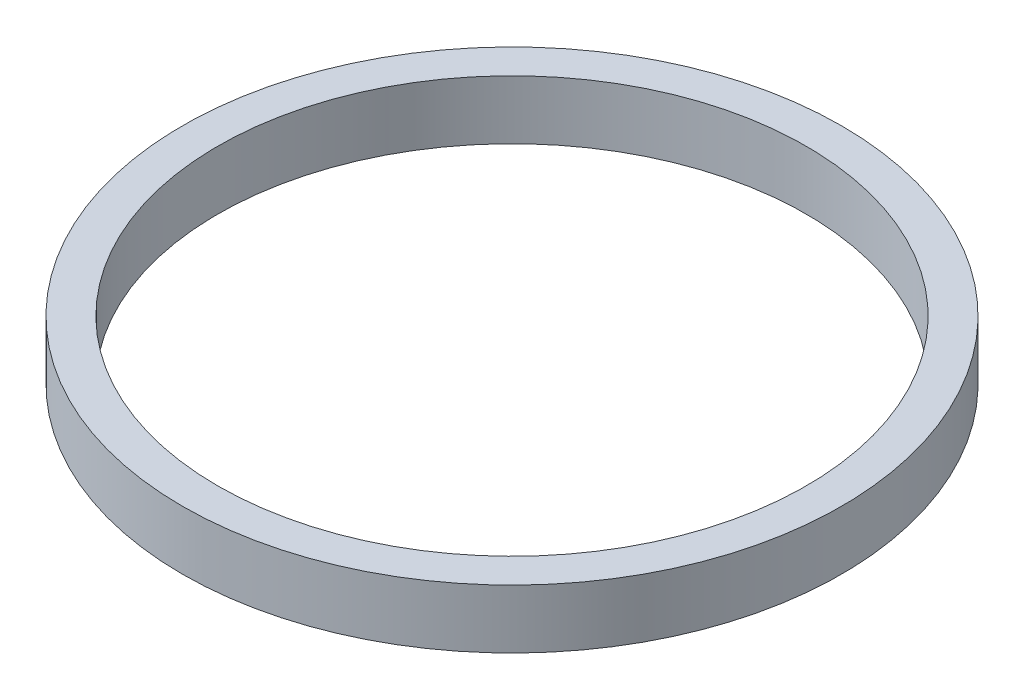
ISO-10303-21;
HEADER;
FILE_DESCRIPTION(('STEP AP214'),'2;1');
FILE_NAME('part.step','',(''),(''),'','','');
FILE_SCHEMA(('AUTOMOTIVE_DESIGN { 1 0 10303 214 1 1 1 1 }'));
ENDSEC;
DATA;
#1=APPLICATION_CONTEXT('core data for automotive mechanical design processes');
#2=APPLICATION_PROTOCOL_DEFINITION('international standard','automotive_design',2000,#1);
#3=PRODUCT_CONTEXT('',#1,'mechanical');
#4=PRODUCT('Part','Part','',(#3));
#5=PRODUCT_RELATED_PRODUCT_CATEGORY('part','',(#4));
#6=PRODUCT_DEFINITION_FORMATION('','',#4);
#7=PRODUCT_DEFINITION_CONTEXT('part definition',#1,'design');
#8=PRODUCT_DEFINITION('design','',#6,#7);
#9=PRODUCT_DEFINITION_SHAPE('','',#8);
#10=(LENGTH_UNIT() NAMED_UNIT(*) SI_UNIT(.MILLI.,.METRE.));
#11=(NAMED_UNIT(*) PLANE_ANGLE_UNIT() SI_UNIT($,.RADIAN.));
#12=(NAMED_UNIT(*) SI_UNIT($,.STERADIAN.) SOLID_ANGLE_UNIT());
#13=UNCERTAINTY_MEASURE_WITH_UNIT(LENGTH_MEASURE(1.E-05),#10,'distance_accuracy_value','');
#14=(GEOMETRIC_REPRESENTATION_CONTEXT(3) GLOBAL_UNCERTAINTY_ASSIGNED_CONTEXT((#13)) GLOBAL_UNIT_ASSIGNED_CONTEXT((#10,
#11,#12)) REPRESENTATION_CONTEXT('',''));
#15=CARTESIAN_POINT('',(0.,0.,0.));
#16=DIRECTION('',(0.,0.,1.));
#17=DIRECTION('',(1.,0.,0.));
#18=AXIS2_PLACEMENT_3D('',#15,#16,#17);
#19=CARTESIAN_POINT('',(0.,2.5,0.));
#20=DIRECTION('',(0.,1.,0.));
#21=DIRECTION('',(0.,0.,1.));
#22=AXIS2_PLACEMENT_3D('',#19,#20,#21);
#23=PLANE('',#22);
#24=CARTESIAN_POINT('',(0.,2.5,0.));
#25=DIRECTION('',(0.,1.,0.));
#26=DIRECTION('',(0.,0.,1.));
#27=AXIS2_PLACEMENT_3D('',#24,#25,#26);
#28=CIRCLE('',#27,14.);
#29=CARTESIAN_POINT('',(0.,2.5,14.));
#30=VERTEX_POINT('',#29);
#31=EDGE_CURVE('E10',#30,#30,#28,.T.);
#32=ORIENTED_EDGE('',*,*,#31,.T.);
#33=EDGE_LOOP('',(#32));
#34=FACE_BOUND('',#33,.T.);
#35=CARTESIAN_POINT('',(0.,2.5,0.));
#36=DIRECTION('',(0.,1.,0.));
#37=DIRECTION('',(0.,0.,1.));
#38=AXIS2_PLACEMENT_3D('',#35,#36,#37);
#39=CIRCLE('',#38,12.5);
#40=CARTESIAN_POINT('',(0.,2.5,12.5));
#41=VERTEX_POINT('',#40);
#42=EDGE_CURVE('E42',#41,#41,#39,.T.);
#43=ORIENTED_EDGE('',*,*,#42,.F.);
#44=EDGE_LOOP('',(#43));
#45=FACE_BOUND('',#44,.T.);
#46=ADVANCED_FACE('F31',(#34,#45),#23,.T.);
#47=CARTESIAN_POINT('',(0.,0.,0.));
#48=DIRECTION('',(0.,1.,0.));
#49=DIRECTION('',(0.,0.,1.));
#50=AXIS2_PLACEMENT_3D('',#47,#48,#49);
#51=PLANE('',#50);
#52=CARTESIAN_POINT('',(0.,0.,0.));
#53=DIRECTION('',(0.,1.,0.));
#54=DIRECTION('',(0.,0.,1.));
#55=AXIS2_PLACEMENT_3D('',#52,#53,#54);
#56=CIRCLE('',#55,14.);
#57=CARTESIAN_POINT('',(0.,0.,14.));
#58=VERTEX_POINT('',#57);
#59=EDGE_CURVE('E35',#58,#58,#56,.T.);
#60=ORIENTED_EDGE('',*,*,#59,.F.);
#61=EDGE_LOOP('',(#60));
#62=FACE_BOUND('',#61,.T.);
#63=CARTESIAN_POINT('',(0.,0.,0.));
#64=DIRECTION('',(0.,1.,0.));
#65=DIRECTION('',(0.,0.,1.));
#66=AXIS2_PLACEMENT_3D('',#63,#64,#65);
#67=CIRCLE('',#66,12.5);
#68=CARTESIAN_POINT('',(0.,0.,12.5));
#69=VERTEX_POINT('',#68);
#70=EDGE_CURVE('E44',#69,#69,#67,.T.);
#71=ORIENTED_EDGE('',*,*,#70,.T.);
#72=EDGE_LOOP('',(#71));
#73=FACE_BOUND('',#72,.T.);
#74=ADVANCED_FACE('F54',(#62,#73),#51,.F.);
#75=CARTESIAN_POINT('',(0.,2.5,0.));
#76=DIRECTION('',(0.,-1.,0.));
#77=DIRECTION('',(0.,0.,-1.));
#78=AXIS2_PLACEMENT_3D('',#75,#76,#77);
#79=CYLINDRICAL_SURFACE('',#78,14.);
#80=ORIENTED_EDGE('',*,*,#31,.F.);
#81=EDGE_LOOP('',(#80));
#82=FACE_BOUND('',#81,.T.);
#83=ORIENTED_EDGE('',*,*,#59,.T.);
#84=EDGE_LOOP('',(#83));
#85=FACE_BOUND('',#84,.T.);
#86=ADVANCED_FACE('F33',(#82,#85),#79,.T.);
#87=CARTESIAN_POINT('',(0.,2.5,0.));
#88=DIRECTION('',(0.,-1.,0.));
#89=DIRECTION('',(0.,0.,-1.));
#90=AXIS2_PLACEMENT_3D('',#87,#88,#89);
#91=CYLINDRICAL_SURFACE('',#90,12.5);
#92=ORIENTED_EDGE('',*,*,#42,.T.);
#93=EDGE_LOOP('',(#92));
#94=FACE_BOUND('',#93,.T.);
#95=ORIENTED_EDGE('',*,*,#70,.F.);
#96=EDGE_LOOP('',(#95));
#97=FACE_BOUND('',#96,.T.);
#98=ADVANCED_FACE('F50',(#94,#97),#91,.F.);
#99=CLOSED_SHELL('',(#46,#74,#86,#98));
#100=MANIFOLD_SOLID_BREP('B2',#99);
#101=ADVANCED_BREP_SHAPE_REPRESENTATION('',(#18,#100),#14);
#102=SHAPE_DEFINITION_REPRESENTATION(#9,#101);
ENDSEC;
END-ISO-10303-21;
